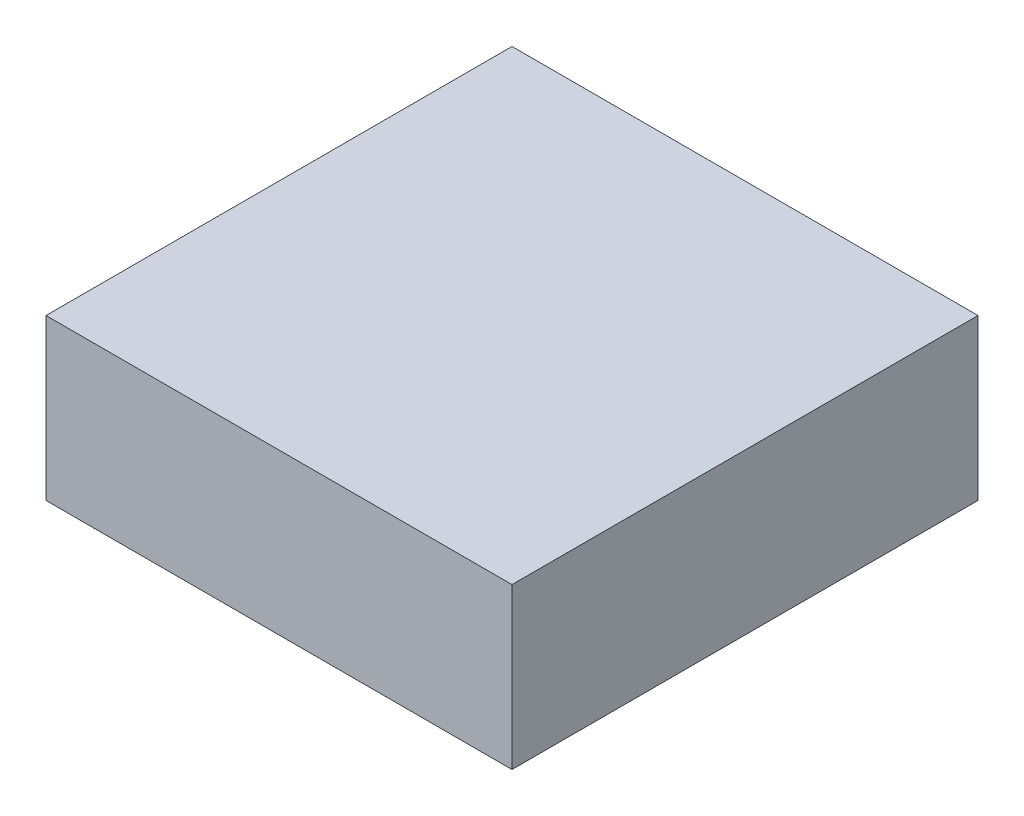
ISO-10303-21;
HEADER;
FILE_DESCRIPTION(('STEP AP214'),'2;1');
FILE_NAME('part.step','',(''),(''),'','','');
FILE_SCHEMA(('AUTOMOTIVE_DESIGN { 1 0 10303 214 1 1 1 1 }'));
ENDSEC;
DATA;
#1=APPLICATION_CONTEXT('core data for automotive mechanical design processes');
#2=APPLICATION_PROTOCOL_DEFINITION('international standard','automotive_design',2000,#1);
#3=PRODUCT_CONTEXT('',#1,'mechanical');
#4=PRODUCT('Part','Part','',(#3));
#5=PRODUCT_RELATED_PRODUCT_CATEGORY('part','',(#4));
#6=PRODUCT_DEFINITION_FORMATION('','',#4);
#7=PRODUCT_DEFINITION_CONTEXT('part definition',#1,'design');
#8=PRODUCT_DEFINITION('design','',#6,#7);
#9=PRODUCT_DEFINITION_SHAPE('','',#8);
#10=(LENGTH_UNIT() NAMED_UNIT(*) SI_UNIT(.MILLI.,.METRE.));
#11=(NAMED_UNIT(*) PLANE_ANGLE_UNIT() SI_UNIT($,.RADIAN.));
#12=(NAMED_UNIT(*) SI_UNIT($,.STERADIAN.) SOLID_ANGLE_UNIT());
#13=UNCERTAINTY_MEASURE_WITH_UNIT(LENGTH_MEASURE(1.E-05),#10,'distance_accuracy_value','');
#14=(GEOMETRIC_REPRESENTATION_CONTEXT(3) GLOBAL_UNCERTAINTY_ASSIGNED_CONTEXT((#13)) GLOBAL_UNIT_ASSIGNED_CONTEXT((#10,
#11,#12)) REPRESENTATION_CONTEXT('',''));
#15=CARTESIAN_POINT('',(0.,0.,0.));
#16=DIRECTION('',(0.,0.,1.));
#17=DIRECTION('',(1.,0.,0.));
#18=AXIS2_PLACEMENT_3D('',#15,#16,#17);
#19=CARTESIAN_POINT('',(32.,22.,-32.));
#20=DIRECTION('',(-1.,0.,0.));
#21=DIRECTION('',(0.,0.,1.));
#22=AXIS2_PLACEMENT_3D('',#19,#20,#21);
#23=PLANE('',#22);
#24=DIRECTION('',(0.,0.,-1.));
#25=VECTOR('',#24,1.);
#26=CARTESIAN_POINT('',(32.,0.,-32.));
#27=LINE('',#26,#25);
#28=CARTESIAN_POINT('',(32.,0.,32.));
#29=VERTEX_POINT('',#28);
#30=CARTESIAN_POINT('',(32.,0.,-32.));
#31=VERTEX_POINT('',#30);
#32=EDGE_CURVE('E96',#29,#31,#27,.T.);
#33=ORIENTED_EDGE('',*,*,#32,.T.);
#34=DIRECTION('',(0.,-1.,0.));
#35=VECTOR('',#34,1.);
#36=CARTESIAN_POINT('',(32.,22.,-32.));
#37=LINE('',#36,#35);
#38=CARTESIAN_POINT('',(32.,22.,-32.));
#39=VERTEX_POINT('',#38);
#40=EDGE_CURVE('E11',#39,#31,#37,.T.);
#41=ORIENTED_EDGE('',*,*,#40,.F.);
#42=DIRECTION('',(0.,0.,-1.));
#43=VECTOR('',#42,1.);
#44=CARTESIAN_POINT('',(32.,22.,-32.));
#45=LINE('',#44,#43);
#46=CARTESIAN_POINT('',(32.,22.,32.));
#47=VERTEX_POINT('',#46);
#48=EDGE_CURVE('E84',#47,#39,#45,.T.);
#49=ORIENTED_EDGE('',*,*,#48,.F.);
#50=DIRECTION('',(0.,-1.,0.));
#51=VECTOR('',#50,1.);
#52=CARTESIAN_POINT('',(32.,22.,32.));
#53=LINE('',#52,#51);
#54=EDGE_CURVE('E92',#47,#29,#53,.T.);
#55=ORIENTED_EDGE('',*,*,#54,.T.);
#56=EDGE_LOOP('',(#33,#41,#49,#55));
#57=FACE_BOUND('',#56,.T.);
#58=ADVANCED_FACE('F33',(#57),#23,.F.);
#59=CARTESIAN_POINT('',(-32.,22.,-32.));
#60=DIRECTION('',(0.,0.,1.));
#61=DIRECTION('',(1.,0.,0.));
#62=AXIS2_PLACEMENT_3D('',#59,#60,#61);
#63=PLANE('',#62);
#64=DIRECTION('',(-1.,0.,0.));
#65=VECTOR('',#64,1.);
#66=CARTESIAN_POINT('',(-32.,0.,-32.));
#67=LINE('',#66,#65);
#68=CARTESIAN_POINT('',(-32.,0.,-32.));
#69=VERTEX_POINT('',#68);
#70=EDGE_CURVE('E88',#31,#69,#67,.T.);
#71=ORIENTED_EDGE('',*,*,#70,.T.);
#72=DIRECTION('',(0.,-1.,0.));
#73=VECTOR('',#72,1.);
#74=CARTESIAN_POINT('',(-32.,22.,-32.));
#75=LINE('',#74,#73);
#76=CARTESIAN_POINT('',(-32.,22.,-32.));
#77=VERTEX_POINT('',#76);
#78=EDGE_CURVE('E41',#77,#69,#75,.T.);
#79=ORIENTED_EDGE('',*,*,#78,.F.);
#80=DIRECTION('',(-1.,0.,0.));
#81=VECTOR('',#80,1.);
#82=CARTESIAN_POINT('',(-32.,22.,-32.));
#83=LINE('',#82,#81);
#84=EDGE_CURVE('E79',#39,#77,#83,.T.);
#85=ORIENTED_EDGE('',*,*,#84,.F.);
#86=ORIENTED_EDGE('',*,*,#40,.T.);
#87=EDGE_LOOP('',(#71,#79,#85,#86));
#88=FACE_BOUND('',#87,.T.);
#89=ADVANCED_FACE('F87',(#88),#63,.F.);
#90=CARTESIAN_POINT('',(-32.,22.,-32.));
#91=DIRECTION('',(1.,0.,0.));
#92=DIRECTION('',(0.,0.,-1.));
#93=AXIS2_PLACEMENT_3D('',#90,#91,#92);
#94=PLANE('',#93);
#95=DIRECTION('',(0.,0.,1.));
#96=VECTOR('',#95,1.);
#97=CARTESIAN_POINT('',(-32.,0.,-32.));
#98=LINE('',#97,#96);
#99=CARTESIAN_POINT('',(-32.,0.,32.));
#100=VERTEX_POINT('',#99);
#101=EDGE_CURVE('E66',#69,#100,#98,.T.);
#102=ORIENTED_EDGE('',*,*,#101,.T.);
#103=DIRECTION('',(0.,-1.,0.));
#104=VECTOR('',#103,1.);
#105=CARTESIAN_POINT('',(-32.,22.,32.));
#106=LINE('',#105,#104);
#107=CARTESIAN_POINT('',(-32.,22.,32.));
#108=VERTEX_POINT('',#107);
#109=EDGE_CURVE('E89',#108,#100,#106,.T.);
#110=ORIENTED_EDGE('',*,*,#109,.F.);
#111=DIRECTION('',(0.,0.,1.));
#112=VECTOR('',#111,1.);
#113=CARTESIAN_POINT('',(-32.,22.,-32.));
#114=LINE('',#113,#112);
#115=EDGE_CURVE('E82',#77,#108,#114,.T.);
#116=ORIENTED_EDGE('',*,*,#115,.F.);
#117=ORIENTED_EDGE('',*,*,#78,.T.);
#118=EDGE_LOOP('',(#102,#110,#116,#117));
#119=FACE_BOUND('',#118,.T.);
#120=ADVANCED_FACE('F90',(#119),#94,.F.);
#121=CARTESIAN_POINT('',(-32.,22.,32.));
#122=DIRECTION('',(0.,0.,-1.));
#123=DIRECTION('',(-1.,0.,0.));
#124=AXIS2_PLACEMENT_3D('',#121,#122,#123);
#125=PLANE('',#124);
#126=DIRECTION('',(1.,0.,0.));
#127=VECTOR('',#126,1.);
#128=CARTESIAN_POINT('',(-32.,0.,32.));
#129=LINE('',#128,#127);
#130=EDGE_CURVE('E72',#100,#29,#129,.T.);
#131=ORIENTED_EDGE('',*,*,#130,.T.);
#132=ORIENTED_EDGE('',*,*,#54,.F.);
#133=DIRECTION('',(1.,0.,0.));
#134=VECTOR('',#133,1.);
#135=CARTESIAN_POINT('',(-32.,22.,32.));
#136=LINE('',#135,#134);
#137=EDGE_CURVE('E49',#108,#47,#136,.T.);
#138=ORIENTED_EDGE('',*,*,#137,.F.);
#139=ORIENTED_EDGE('',*,*,#109,.T.);
#140=EDGE_LOOP('',(#131,#132,#138,#139));
#141=FACE_BOUND('',#140,.T.);
#142=ADVANCED_FACE('F103',(#141),#125,.F.);
#143=CARTESIAN_POINT('',(0.,22.,0.));
#144=DIRECTION('',(0.,1.,0.));
#145=DIRECTION('',(0.,0.,1.));
#146=AXIS2_PLACEMENT_3D('',#143,#144,#145);
#147=PLANE('',#146);
#148=ORIENTED_EDGE('',*,*,#48,.T.);
#149=ORIENTED_EDGE('',*,*,#84,.T.);
#150=ORIENTED_EDGE('',*,*,#115,.T.);
#151=ORIENTED_EDGE('',*,*,#137,.T.);
#152=EDGE_LOOP('',(#148,#149,#150,#151));
#153=FACE_BOUND('',#152,.T.);
#154=ADVANCED_FACE('F80',(#153),#147,.T.);
#155=CARTESIAN_POINT('',(0.,0.,0.));
#156=DIRECTION('',(0.,1.,0.));
#157=DIRECTION('',(0.,0.,1.));
#158=AXIS2_PLACEMENT_3D('',#155,#156,#157);
#159=PLANE('',#158);
#160=ORIENTED_EDGE('',*,*,#32,.F.);
#161=ORIENTED_EDGE('',*,*,#130,.F.);
#162=ORIENTED_EDGE('',*,*,#101,.F.);
#163=ORIENTED_EDGE('',*,*,#70,.F.);
#164=EDGE_LOOP('',(#160,#161,#162,#163));
#165=FACE_BOUND('',#164,.T.);
#166=ADVANCED_FACE('F106',(#165),#159,.F.);
#167=CLOSED_SHELL('',(#58,#89,#120,#142,#154,#166));
#168=MANIFOLD_SOLID_BREP('B2',#167);
#169=ADVANCED_BREP_SHAPE_REPRESENTATION('',(#18,#168),#14);
#170=SHAPE_DEFINITION_REPRESENTATION(#9,#169);
ENDSEC;
END-ISO-10303-21;
